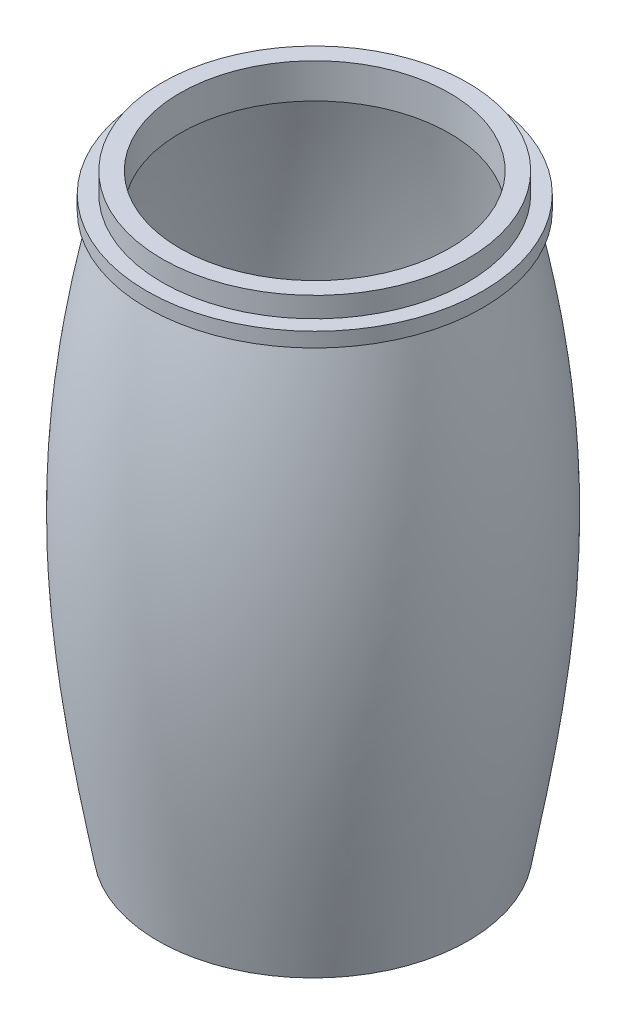
ISO-10303-21;
HEADER;
FILE_DESCRIPTION(('STEP AP214'),'2;1');
FILE_NAME('part.step','',(''),(''),'','','');
FILE_SCHEMA(('AUTOMOTIVE_DESIGN { 1 0 10303 214 1 1 1 1 }'));
ENDSEC;
DATA;
#1=APPLICATION_CONTEXT('core data for automotive mechanical design processes');
#2=APPLICATION_PROTOCOL_DEFINITION('international standard','automotive_design',2000,#1);
#3=PRODUCT_CONTEXT('',#1,'mechanical');
#4=PRODUCT('Part','Part','',(#3));
#5=PRODUCT_RELATED_PRODUCT_CATEGORY('part','',(#4));
#6=PRODUCT_DEFINITION_FORMATION('','',#4);
#7=PRODUCT_DEFINITION_CONTEXT('part definition',#1,'design');
#8=PRODUCT_DEFINITION('design','',#6,#7);
#9=PRODUCT_DEFINITION_SHAPE('','',#8);
#10=(LENGTH_UNIT() NAMED_UNIT(*) SI_UNIT(.MILLI.,.METRE.));
#11=(NAMED_UNIT(*) PLANE_ANGLE_UNIT() SI_UNIT($,.RADIAN.));
#12=(NAMED_UNIT(*) SI_UNIT($,.STERADIAN.) SOLID_ANGLE_UNIT());
#13=UNCERTAINTY_MEASURE_WITH_UNIT(LENGTH_MEASURE(1.E-05),#10,'distance_accuracy_value','');
#14=(GEOMETRIC_REPRESENTATION_CONTEXT(3) GLOBAL_UNCERTAINTY_ASSIGNED_CONTEXT((#13)) GLOBAL_UNIT_ASSIGNED_CONTEXT((#10,
#11,#12)) REPRESENTATION_CONTEXT('',''));
#15=CARTESIAN_POINT('',(0.,0.,0.));
#16=DIRECTION('',(0.,0.,1.));
#17=DIRECTION('',(1.,0.,0.));
#18=AXIS2_PLACEMENT_3D('',#15,#16,#17);
#19=CARTESIAN_POINT('',(275.,0.,0.));
#20=CARTESIAN_POINT('',(334.204802314761,324.779890339904,0.));
#21=CARTESIAN_POINT('',(372.234274409589,596.01883272794,0.));
#22=CARTESIAN_POINT('',(272.550609758041,1000.,0.));
#23=CARTESIAN_POINT('',(271.553773111525,1004.03981167272,0.));
#24=CARTESIAN_POINT('',(270.55693646501,1008.07962334544,0.));
#25=CARTESIAN_POINT('',(269.560099818494,1012.11943501816,0.));
#26=B_SPLINE_CURVE_WITH_KNOTS('',3,(#19,#20,#21,#22,#23,#24,#25),.UNSPECIFIED.,.F.,.F.,(4,3,4),
(0.,1.,1.01),.UNSPECIFIED.);
#27=CARTESIAN_POINT('',(0.,0.,0.));
#28=DIRECTION('',(0.,-1.,0.));
#29=AXIS1_PLACEMENT('',#27,#28);
#30=SURFACE_OF_REVOLUTION('',#26,#29);
#31=CARTESIAN_POINT('',(0.,0.,0.));
#32=DIRECTION('',(0.,-1.,0.));
#33=DIRECTION('',(0.,0.,-1.));
#34=AXIS2_PLACEMENT_3D('',#31,#32,#33);
#35=CIRCLE('',#34,275.);
#36=CARTESIAN_POINT('',(0.,0.,-275.));
#37=VERTEX_POINT('',#36);
#38=EDGE_CURVE('E387',#37,#37,#35,.T.);
#39=ORIENTED_EDGE('',*,*,#38,.F.);
#40=EDGE_LOOP('',(#39));
#41=FACE_BOUND('',#40,.T.);
#42=CARTESIAN_POINT('',(0.,984.270895849354,0.));
#43=DIRECTION('',(0.,-1.,0.));
#44=DIRECTION('',(0.,0.,-1.));
#45=AXIS2_PLACEMENT_3D('',#42,#43,#44);
#46=CIRCLE('',#45,276.378481701434);
#47=CARTESIAN_POINT('',(0.,984.270895849354,-276.378481701434));
#48=VERTEX_POINT('',#47);
#49=EDGE_CURVE('E145',#48,#48,#46,.T.);
#50=ORIENTED_EDGE('',*,*,#49,.T.);
#51=EDGE_LOOP('',(#50));
#52=FACE_BOUND('',#51,.T.);
#53=ADVANCED_FACE('F42',(#41,#52),#30,.F.);
#54=CARTESIAN_POINT('',(0.,0.,0.));
#55=DIRECTION('',(0.,-1.,0.));
#56=DIRECTION('',(0.,0.,-1.));
#57=AXIS2_PLACEMENT_3D('',#54,#55,#56);
#58=PLANE('',#57);
#59=ORIENTED_EDGE('',*,*,#38,.T.);
#60=EDGE_LOOP('',(#59));
#61=FACE_BOUND('',#60,.T.);
#62=ADVANCED_FACE('F44',(#61),#58,.T.);
#63=CARTESIAN_POINT('',(3.,984.270895849354,0.));
#64=DIRECTION('',(0.,1.,0.));
#65=DIRECTION('',(0.,0.,1.));
#66=AXIS2_PLACEMENT_3D('',#63,#64,#65);
#67=PLANE('',#66);
#68=CARTESIAN_POINT('',(3.,984.270895849354,0.));
#69=DIRECTION('',(0.,1.,0.));
#70=DIRECTION('',(0.,0.,1.));
#71=AXIS2_PLACEMENT_3D('',#68,#69,#70);
#72=CIRCLE('',#71,238.662190357556);
#73=CARTESIAN_POINT('',(3.,984.270895849354,238.662190357556));
#74=VERTEX_POINT('',#73);
#75=EDGE_CURVE('E119',#74,#74,#72,.T.);
#76=ORIENTED_EDGE('',*,*,#75,.T.);
#77=EDGE_LOOP('',(#76));
#78=FACE_BOUND('',#77,.T.);
#79=CARTESIAN_POINT('',(0.,984.270895849354,0.));
#80=DIRECTION('',(0.,-1.,0.));
#81=DIRECTION('',(0.,0.,-1.));
#82=AXIS2_PLACEMENT_3D('',#79,#80,#81);
#83=CIRCLE('',#82,271.236255874264);
#84=CARTESIAN_POINT('',(0.,984.270895849354,-271.236255874264));
#85=VERTEX_POINT('',#84);
#86=EDGE_CURVE('E46',#85,#85,#83,.T.);
#87=ORIENTED_EDGE('',*,*,#86,.T.);
#88=EDGE_LOOP('',(#87));
#89=FACE_BOUND('',#88,.T.);
#90=ADVANCED_FACE('F181',(#78,#89),#67,.F.);
#91=CARTESIAN_POINT('',(3.,1010.,0.));
#92=DIRECTION('',(0.,1.,0.));
#93=DIRECTION('',(0.,0.,1.));
#94=AXIS2_PLACEMENT_3D('',#91,#92,#93);
#95=PLANE('',#94);
#96=CARTESIAN_POINT('',(3.,1010.,0.));
#97=DIRECTION('',(0.,1.,0.));
#98=DIRECTION('',(0.,0.,1.));
#99=AXIS2_PLACEMENT_3D('',#96,#97,#98);
#100=CIRCLE('',#99,297.647770332171);
#101=CARTESIAN_POINT('',(3.,1010.,297.647770332171));
#102=VERTEX_POINT('',#101);
#103=EDGE_CURVE('E127',#102,#102,#100,.T.);
#104=ORIENTED_EDGE('',*,*,#103,.T.);
#105=EDGE_LOOP('',(#104));
#106=FACE_BOUND('',#105,.T.);
#107=CARTESIAN_POINT('',(3.,1010.,0.));
#108=DIRECTION('',(0.,1.,0.));
#109=DIRECTION('',(0.,0.,1.));
#110=AXIS2_PLACEMENT_3D('',#107,#108,#109);
#111=CIRCLE('',#110,270.625833245653);
#112=CARTESIAN_POINT('',(3.,1010.,270.625833245653));
#113=VERTEX_POINT('',#112);
#114=EDGE_CURVE('E107',#113,#113,#111,.T.);
#115=ORIENTED_EDGE('',*,*,#114,.F.);
#116=EDGE_LOOP('',(#115));
#117=FACE_BOUND('',#116,.T.);
#118=ADVANCED_FACE('F177',(#106,#117),#95,.T.);
#119=CARTESIAN_POINT('',(3.,994.270895849354,0.));
#120=DIRECTION('',(0.,1.,0.));
#121=DIRECTION('',(0.,0.,1.));
#122=AXIS2_PLACEMENT_3D('',#119,#120,#121);
#123=CYLINDRICAL_SURFACE('',#122,297.647770332171);
#124=CARTESIAN_POINT('',(3.,984.270895849354,0.));
#125=DIRECTION('',(0.,1.,0.));
#126=DIRECTION('',(0.,0.,1.));
#127=AXIS2_PLACEMENT_3D('',#124,#125,#126);
#128=CIRCLE('',#127,297.647770332171);
#129=CARTESIAN_POINT('',(3.,984.270895849354,297.647770332171));
#130=VERTEX_POINT('',#129);
#131=EDGE_CURVE('E123',#130,#130,#128,.T.);
#132=ORIENTED_EDGE('',*,*,#131,.T.);
#133=EDGE_LOOP('',(#132));
#134=FACE_BOUND('',#133,.T.);
#135=ORIENTED_EDGE('',*,*,#103,.F.);
#136=EDGE_LOOP('',(#135));
#137=FACE_BOUND('',#136,.T.);
#138=ADVANCED_FACE('F180',(#134,#137),#123,.T.);
#139=ORIENTED_EDGE('',*,*,#49,.F.);
#140=EDGE_LOOP('',(#139));
#141=FACE_BOUND('',#140,.T.);
#142=ORIENTED_EDGE('',*,*,#131,.F.);
#143=EDGE_LOOP('',(#142));
#144=FACE_BOUND('',#143,.T.);
#145=ADVANCED_FACE('F185',(#141,#144),#67,.F.);
#146=CARTESIAN_POINT('',(3.,994.270895849354,0.));
#147=DIRECTION('',(0.,1.,0.));
#148=DIRECTION('',(0.,0.,1.));
#149=AXIS2_PLACEMENT_3D('',#146,#147,#148);
#150=CYLINDRICAL_SURFACE('',#149,238.662190357556);
#151=CARTESIAN_POINT('',(3.,1046.00067138125,0.));
#152=DIRECTION('',(0.,1.,0.));
#153=DIRECTION('',(0.,0.,1.));
#154=AXIS2_PLACEMENT_3D('',#151,#152,#153);
#155=CIRCLE('',#154,238.662190357556);
#156=CARTESIAN_POINT('',(3.,1046.00067138125,238.662190357556));
#157=VERTEX_POINT('',#156);
#158=EDGE_CURVE('E115',#157,#157,#155,.T.);
#159=ORIENTED_EDGE('',*,*,#158,.T.);
#160=EDGE_LOOP('',(#159));
#161=FACE_BOUND('',#160,.T.);
#162=ORIENTED_EDGE('',*,*,#75,.F.);
#163=EDGE_LOOP('',(#162));
#164=FACE_BOUND('',#163,.T.);
#165=ADVANCED_FACE('F189',(#161,#164),#150,.F.);
#166=CARTESIAN_POINT('',(3.,1046.00067138125,0.));
#167=DIRECTION('',(0.,1.,0.));
#168=DIRECTION('',(0.,0.,1.));
#169=AXIS2_PLACEMENT_3D('',#166,#167,#168);
#170=PLANE('',#169);
#171=CARTESIAN_POINT('',(3.,1046.00067138125,0.));
#172=DIRECTION('',(0.,1.,0.));
#173=DIRECTION('',(0.,0.,1.));
#174=AXIS2_PLACEMENT_3D('',#171,#172,#173);
#175=CIRCLE('',#174,270.625833245653);
#176=CARTESIAN_POINT('',(3.,1046.00067138125,270.625833245653));
#177=VERTEX_POINT('',#176);
#178=EDGE_CURVE('E111',#177,#177,#175,.T.);
#179=ORIENTED_EDGE('',*,*,#178,.T.);
#180=EDGE_LOOP('',(#179));
#181=FACE_BOUND('',#180,.T.);
#182=ORIENTED_EDGE('',*,*,#158,.F.);
#183=EDGE_LOOP('',(#182));
#184=FACE_BOUND('',#183,.T.);
#185=ADVANCED_FACE('F193',(#181,#184),#170,.T.);
#186=CARTESIAN_POINT('',(3.,994.270895849354,0.));
#187=DIRECTION('',(0.,1.,0.));
#188=DIRECTION('',(0.,0.,1.));
#189=AXIS2_PLACEMENT_3D('',#186,#187,#188);
#190=CYLINDRICAL_SURFACE('',#189,270.625833245653);
#191=ORIENTED_EDGE('',*,*,#178,.F.);
#192=EDGE_LOOP('',(#191));
#193=FACE_BOUND('',#192,.T.);
#194=ORIENTED_EDGE('',*,*,#114,.T.);
#195=EDGE_LOOP('',(#194));
#196=FACE_BOUND('',#195,.T.);
#197=ADVANCED_FACE('F175',(#193,#196),#190,.T.);
#198=CARTESIAN_POINT('',(0.,5.,0.));
#199=DIRECTION('',(0.,-1.,0.));
#200=DIRECTION('',(0.,0.,-1.));
#201=AXIS2_PLACEMENT_3D('',#198,#199,#200);
#202=PLANE('',#201);
#203=CARTESIAN_POINT('',(0.,5.,0.));
#204=DIRECTION('',(0.,-1.,0.));
#205=DIRECTION('',(0.,0.,-1.));
#206=AXIS2_PLACEMENT_3D('',#203,#204,#205);
#207=CIRCLE('',#206,270.828443629604);
#208=CARTESIAN_POINT('',(0.,5.,-270.828443629604));
#209=VERTEX_POINT('',#208);
#210=EDGE_CURVE('E389',#209,#209,#207,.T.);
#211=ORIENTED_EDGE('',*,*,#210,.F.);
#212=EDGE_LOOP('',(#211));
#213=FACE_BOUND('',#212,.T.);
#214=ADVANCED_FACE('F172',(#213),#202,.F.);
#215=CARTESIAN_POINT('',(275.,0.,0.));
#216=CARTESIAN_POINT('',(334.204802314761,324.779890339904,0.));
#217=CARTESIAN_POINT('',(372.234274409589,596.01883272794,0.));
#218=CARTESIAN_POINT('',(271.553773111525,1004.03981167272,0.));
#219=CARTESIAN_POINT('',(270.55693646501,1008.07962334544,0.));
#220=CARTESIAN_POINT('',(269.560099818494,1012.11943501816,0.));
#221=B_SPLINE_CURVE_WITH_KNOTS('',3,(#215,#216,#217,#218,#219,#220),.UNSPECIFIED.,.F.,.F.,(4,2,
4),(0.,1.,1.01),.UNSPECIFIED.);
#222=CARTESIAN_POINT('',(0.,0.,0.));
#223=DIRECTION('',(0.,-1.,0.));
#224=AXIS1_PLACEMENT('',#222,#223);
#225=SURFACE_OF_REVOLUTION('',#221,#224);
#226=OFFSET_SURFACE('',#225,5.,.F.);
#227=ORIENTED_EDGE('',*,*,#210,.T.);
#228=EDGE_LOOP('',(#227));
#229=FACE_BOUND('',#228,.T.);
#230=ORIENTED_EDGE('',*,*,#86,.F.);
#231=EDGE_LOOP('',(#230));
#232=FACE_BOUND('',#231,.T.);
#233=ADVANCED_FACE('F170',(#229,#232),#226,.T.);
#234=CLOSED_SHELL('',(#53,#62,#90,#118,#138,#145,#165,#185,#197,#214,#233));
#235=CARTESIAN_POINT('',(3.,994.270895849354,0.));
#236=DIRECTION('',(0.,1.,0.));
#237=DIRECTION('',(0.,0.,1.));
#238=AXIS2_PLACEMENT_3D('',#235,#236,#237);
#239=CYLINDRICAL_SURFACE('',#238,270.625833245653);
#240=CARTESIAN_POINT('',(3.,994.270895849354,0.));
#241=DIRECTION('',(0.,1.,0.));
#242=DIRECTION('',(0.,0.,1.));
#243=AXIS2_PLACEMENT_3D('',#240,#241,#242);
#244=CIRCLE('',#243,270.625833245653);
#245=CARTESIAN_POINT('',(-161.763347415489,994.270895849354,214.68903318136));
#246=VERTEX_POINT('',#245);
#247=CARTESIAN_POINT('',(-161.763347415497,994.270895849354,-214.689033181354));
#248=VERTEX_POINT('',#247);
#249=EDGE_CURVE('E79',#246,#248,#244,.F.);
#250=ORIENTED_EDGE('',*,*,#249,.F.);
#251=CARTESIAN_POINT('',(-161.763347415489,994.270895849354,214.68903318136));
#252=CARTESIAN_POINT('',(-164.177344048722,994.380947843191,212.836435059327));
#253=CARTESIAN_POINT('',(-166.560109817544,994.489560540003,210.9430585513));
#254=CARTESIAN_POINT('',(-171.260447371596,994.703785357315,207.077025815732));
#255=CARTESIAN_POINT('',(-173.578021191126,994.809397571446,205.104372066696));
#256=CARTESIAN_POINT('',(-178.145343286024,995.017504032631,201.081990317334));
#257=CARTESIAN_POINT('',(-180.395093058982,995.119998348531,199.032264021058));
#258=CARTESIAN_POINT('',(-184.824231060039,995.321756026177,194.858050508596));
#259=CARTESIAN_POINT('',(-187.003620140726,995.421019427076,192.733564198959));
#260=CARTESIAN_POINT('',(-191.289571518984,995.616205529584,188.412220670387));
#261=CARTESIAN_POINT('',(-193.396133998455,995.712128239538,186.215363632242));
#262=CARTESIAN_POINT('',(-197.532698118283,995.900465458044,181.753206653212));
#263=CARTESIAN_POINT('',(-199.56274826136,995.992882189358,179.487951769401));
#264=CARTESIAN_POINT('',(-203.545387614709,996.174169000955,174.890235538527));
#265=CARTESIAN_POINT('',(-205.49797745571,996.263039110117,172.557774738962));
#266=CARTESIAN_POINT('',(-209.323470910115,996.437133848815,167.828292947291));
#267=CARTESIAN_POINT('',(-211.196375055208,996.522358502675,165.431272386124));
#268=CARTESIAN_POINT('',(-214.860370633936,996.689067973479,160.57537629474));
#269=CARTESIAN_POINT('',(-216.651462415656,996.770552806336,158.116501027764));
#270=CARTESIAN_POINT('',(-220.149770740567,996.929691150564,153.139718821658));
#271=CARTESIAN_POINT('',(-221.856987465572,997.007344670241,150.621812010506));
#272=CARTESIAN_POINT('',(-225.602714049679,997.177705046136,144.891717327073));
#273=CARTESIAN_POINT('',(-227.617048091758,997.2693083254,141.663650809302));
#274=CARTESIAN_POINT('',(-231.507903715852,997.446228963362,135.125340455895));
#275=CARTESIAN_POINT('',(-233.384423503297,997.531546240205,131.815095550911));
#276=CARTESIAN_POINT('',(-236.996313338716,997.695747226427,125.118281116028));
#277=CARTESIAN_POINT('',(-238.731682659915,997.774630902679,121.731711193252));
#278=CARTESIAN_POINT('',(-242.058141814432,997.92582626818,114.888307545338));
#279=CARTESIAN_POINT('',(-243.649231948767,997.99813797114,111.431473966815));
#280=CARTESIAN_POINT('',(-246.683967078053,998.136049105777,104.454426508696));
#281=CARTESIAN_POINT('',(-248.12764354593,998.20164997023,100.934226347495));
#282=CARTESIAN_POINT('',(-250.865351123112,998.326042757421,93.8360019082885));
#283=CARTESIAN_POINT('',(-252.159382421888,998.384834688781,90.2579777035031));
#284=CARTESIAN_POINT('',(-254.595486867653,998.495507529443,83.0504482298175));
#285=CARTESIAN_POINT('',(-255.737560421711,998.547388457259,79.4209430988545));
#286=CARTESIAN_POINT('',(-257.867684465817,998.644148165916,72.1170256250889));
#287=CARTESIAN_POINT('',(-258.85573552577,998.689026972667,68.4426134485035));
#288=CARTESIAN_POINT('',(-260.978691249529,998.785450414105,59.8270992771451));
#289=CARTESIAN_POINT('',(-262.053228809716,998.834251589102,54.8709615264474));
#290=CARTESIAN_POINT('',(-263.922229387149,998.919140087366,44.9061819277174));
#291=CARTESIAN_POINT('',(-264.716691285037,998.95522735982,39.8975398699273));
#292=CARTESIAN_POINT('',(-266.023061913725,999.014568821433,29.8434367202617));
#293=CARTESIAN_POINT('',(-266.534971125484,999.037823032436,24.7979756910741));
#294=CARTESIAN_POINT('',(-267.274639405664,999.071424094676,14.6855760520174));
#295=CARTESIAN_POINT('',(-267.502362107548,999.081769293983,9.61863477661091));
#296=CARTESIAN_POINT('',(-267.672823664985,999.089513160017,-0.520020393911148));
#297=CARTESIAN_POINT('',(-267.615562028873,999.086911804408,-5.59173429724555));
#298=CARTESIAN_POINT('',(-267.216208714005,999.068769830983,-15.7240400204323));
#299=CARTESIAN_POINT('',(-266.874118344172,999.05322927263,-20.7846318912885));
#300=CARTESIAN_POINT('',(-266.027494707648,999.014770325672,-29.6140594935041));
#301=CARTESIAN_POINT('',(-265.585102457701,998.994674476862,-33.3889907416779));
#302=CARTESIAN_POINT('',(-264.541717902205,998.947279769333,-40.9171258998054));
#303=CARTESIAN_POINT('',(-263.940715473696,998.919980450867,-44.6703284073379));
#304=CARTESIAN_POINT('',(-262.58117402013,998.858230212064,-52.148077330237));
#305=CARTESIAN_POINT('',(-261.822637334417,998.823779397926,-55.8726241702815));
#306=CARTESIAN_POINT('',(-260.567799177429,998.766787328422,-61.4326247764299));
#307=CARTESIAN_POINT('',(-260.130014277799,998.746903997543,-63.2814883419919));
#308=CARTESIAN_POINT('',(-259.215583215997,998.705371026372,-66.9696908216248));
#309=CARTESIAN_POINT('',(-258.73893451628,998.683721270745,-68.8090291054064));
#310=CARTESIAN_POINT('',(-257.250925690704,998.616132863904,-74.3117672045187));
#311=CARTESIAN_POINT('',(-256.181565146293,998.567557902521,-77.9596142082152));
#312=CARTESIAN_POINT('',(-253.890176348897,998.463465994014,-85.2069390732063));
#313=CARTESIAN_POINT('',(-252.668148098707,998.407949047015,-88.8064169353864));
#314=CARTESIAN_POINT('',(-250.722300471123,998.319542066352,-94.1644706920419));
#315=CARTESIAN_POINT('',(-250.054843618977,998.289215990603,-95.9437255311718));
#316=CARTESIAN_POINT('',(-248.682660554077,998.226868027983,-99.4876393025727));
#317=CARTESIAN_POINT('',(-247.977936768501,998.194846251552,-101.252299176772));
#318=CARTESIAN_POINT('',(-245.808361306348,998.096259325366,-106.523132214394));
#319=CARTESIAN_POINT('',(-244.287953060889,998.027165651929,-110.006578588293));
#320=CARTESIAN_POINT('',(-241.100872353011,997.882317868437,-116.908358658232));
#321=CARTESIAN_POINT('',(-239.434106020352,997.806559483751,-120.326648829078));
#322=CARTESIAN_POINT('',(-235.958055750461,997.648548828082,-127.089908954007));
#323=CARTESIAN_POINT('',(-234.148770384284,997.566296491987,-130.43487817252));
#324=CARTESIAN_POINT('',(-230.390849439648,997.39543795698,-137.045649447015));
#325=CARTESIAN_POINT('',(-228.442206797317,997.306831435979,-140.311447478644));
#326=CARTESIAN_POINT('',(-224.408943983857,997.123413693274,-146.758209410608));
#327=CARTESIAN_POINT('',(-222.324311405442,997.028601905418,-149.939165532833));
#328=CARTESIAN_POINT('',(-218.025060440209,996.833041755513,-156.207212440656));
#329=CARTESIAN_POINT('',(-215.810571343914,996.732299297905,-159.294392095464));
#330=CARTESIAN_POINT('',(-211.253753822189,996.524970965126,-165.372601527337));
#331=CARTESIAN_POINT('',(-208.911428616749,996.418385237138,-168.363633723192));
#332=CARTESIAN_POINT('',(-204.10356163925,996.199576035887,-174.243728166105));
#333=CARTESIAN_POINT('',(-201.638044396461,996.087353684931,-177.132810518881));
#334=CARTESIAN_POINT('',(-196.588597761117,995.857485141127,-182.803556430256));
#335=CARTESIAN_POINT('',(-194.004713041361,995.739840994408,-185.585259795947));
#336=CARTESIAN_POINT('',(-189.82776704461,995.549635287514,-189.896463948929));
#337=CARTESIAN_POINT('',(-188.272530659284,995.478808260867,-191.462875468203));
#338=CARTESIAN_POINT('',(-185.124548962595,995.335432836733,-194.556842233365));
#339=CARTESIAN_POINT('',(-183.531811634715,995.262884805601,-196.084405608047));
#340=CARTESIAN_POINT('',(-180.30966783294,995.116104662213,-199.099914102158));
#341=CARTESIAN_POINT('',(-178.680265234074,995.041872727916,-200.587863372318));
#342=CARTESIAN_POINT('',(-175.388644840987,994.891899403625,-203.520719181401));
#343=CARTESIAN_POINT('',(-173.726493293084,994.816161058418,-204.965700219737));
#344=CARTESIAN_POINT('',(-170.367281409703,994.663078615434,-207.814768545417));
#345=CARTESIAN_POINT('',(-168.67021747795,994.585734352225,-209.218851583563));
#346=CARTESIAN_POINT('',(-165.242009544309,994.42947687973,-211.98542712326));
#347=CARTESIAN_POINT('',(-163.510858545239,994.35056334828,-213.347910936042));
#348=CARTESIAN_POINT('',(-161.763347415497,994.270895849354,-214.689033181354));
#349=B_SPLINE_CURVE_WITH_KNOTS('',3,(#251,#252,#253,#254,#255,#256,#257,#258,#259,#260,#261,
#262,#263,#264,#265,#266,#267,#268,#269,#270,#271,#272,#273,#274,#275,#276,#277,#278,#279,#280,
#281,#282,#283,#284,#285,#286,#287,#288,#289,#290,#291,#292,#293,#294,#295,#296,#297,#298,#299,
#300,#301,#302,#303,#304,#305,#306,#307,#308,#309,#310,#311,#312,#313,#314,#315,#316,#317,#318,
#319,#320,#321,#322,#323,#324,#325,#326,#327,#328,#329,#330,#331,#332,#333,#334,#335,#336,#337,
#338,#339,#340,#341,#342,#343,#344,#345,#346,#347,#348),.UNSPECIFIED.,.F.,.F.,(4,2,2,2,2,2,2,2,
2,2,2,2,2,2,2,2,2,2,2,2,2,2,2,2,2,2,2,2,2,2,2,2,2,2,2,2,2,2,2,2,2,2,2,2,2,2,2,2,4),(0.,
9.13436169112395,18.2684380295109,27.40231253474,36.5360763195903,45.6698172891263,
54.7976673221231,63.9254430152938,73.0531577951855,82.1808337359336,91.3084898901418,
102.723259031935,114.138176786677,125.553153312513,136.968106022159,148.380616512735,
159.793112553437,171.205578021432,182.618001260544,197.824176167341,213.03041184687,
228.236621642337,243.444777133522,258.652958862322,273.861070702677,285.260333462377,
296.660323932022,308.060145126781,313.760055553355,319.460338444253,330.861752587794,
342.263166522586,347.964505208012,353.665473024131,365.066069699749,376.474032586633,
387.882109868174,399.290765823414,410.700464127573,422.098989237721,433.49722736942,
444.893204925935,456.284916426886,462.909807992746,469.533301731068,476.156098712215,
482.766650070333,489.377885815603,495.99049312251),.UNSPECIFIED.);
#350=EDGE_CURVE('E66',#246,#248,#349,.T.);
#351=ORIENTED_EDGE('',*,*,#350,.T.);
#352=EDGE_LOOP('',(#250,#351));
#353=FACE_BOUND('',#352,.T.);
#354=ADVANCED_FACE('F78',(#353),#239,.T.);
#355=CARTESIAN_POINT('',(3.,994.270895849354,0.));
#356=DIRECTION('',(0.,1.,0.));
#357=DIRECTION('',(0.,0.,1.));
#358=AXIS2_PLACEMENT_3D('',#355,#356,#357);
#359=PLANE('',#358);
#360=CARTESIAN_POINT('',(0.,994.270895849354,0.));
#361=DIRECTION('',(0.,-1.,0.));
#362=DIRECTION('',(0.,0.,-1.));
#363=AXIS2_PLACEMENT_3D('',#360,#361,#362);
#364=CIRCLE('',#363,268.809898507126);
#365=EDGE_CURVE('E71',#246,#248,#364,.T.);
#366=ORIENTED_EDGE('',*,*,#365,.F.);
#367=ORIENTED_EDGE('',*,*,#249,.T.);
#368=EDGE_LOOP('',(#366,#367));
#369=FACE_BOUND('',#368,.T.);
#370=ADVANCED_FACE('F83',(#369),#359,.T.);
#371=ORIENTED_EDGE('',*,*,#350,.F.);
#372=ORIENTED_EDGE('',*,*,#365,.T.);
#373=EDGE_LOOP('',(#371,#372));
#374=FACE_BOUND('',#373,.T.);
#375=ADVANCED_FACE('F72',(#374),#226,.T.);
#376=CLOSED_SHELL('',(#354,#370,#375));
#377=CARTESIAN_POINT('',(3.,1000.,0.));
#378=DIRECTION('',(0.,1.,0.));
#379=DIRECTION('',(0.,0.,1.));
#380=AXIS2_PLACEMENT_3D('',#377,#378,#379);
#381=PLANE('',#380);
#382=CARTESIAN_POINT('',(0.,1000.,0.));
#383=DIRECTION('',(0.,-1.,0.));
#384=DIRECTION('',(0.,0.,-1.));
#385=AXIS2_PLACEMENT_3D('',#382,#383,#384);
#386=CIRCLE('',#385,272.550609758041);
#387=CARTESIAN_POINT('',(175.748876595979,1000.,208.317467473881));
#388=VERTEX_POINT('',#387);
#389=CARTESIAN_POINT('',(175.748876595976,1000.,-208.317467473883));
#390=VERTEX_POINT('',#389);
#391=EDGE_CURVE('E81',#388,#390,#386,.T.);
#392=ORIENTED_EDGE('',*,*,#391,.F.);
#393=CARTESIAN_POINT('',(3.,1000.,0.));
#394=DIRECTION('',(0.,1.,0.));
#395=DIRECTION('',(0.,0.,1.));
#396=AXIS2_PLACEMENT_3D('',#393,#394,#395);
#397=CIRCLE('',#396,270.625833245653);
#398=EDGE_CURVE('E59',#390,#388,#397,.F.);
#399=ORIENTED_EDGE('',*,*,#398,.F.);
#400=EDGE_LOOP('',(#392,#399));
#401=FACE_BOUND('',#400,.T.);
#402=CARTESIAN_POINT('',(3.,1000.,0.));
#403=DIRECTION('',(0.,1.,0.));
#404=DIRECTION('',(0.,0.,1.));
#405=AXIS2_PLACEMENT_3D('',#402,#403,#404);
#406=CIRCLE('',#405,287.647770332171);
#407=CARTESIAN_POINT('',(3.,1000.,287.647770332171));
#408=VERTEX_POINT('',#407);
#409=EDGE_CURVE('E103',#408,#408,#406,.T.);
#410=ORIENTED_EDGE('',*,*,#409,.F.);
#411=EDGE_LOOP('',(#410));
#412=FACE_BOUND('',#411,.T.);
#413=ADVANCED_FACE('F201',(#401,#412),#381,.F.);
#414=CARTESIAN_POINT('',(0.,994.270895849354,0.));
#415=DIRECTION('',(0.,-1.,0.));
#416=DIRECTION('',(0.,0.,-1.));
#417=AXIS2_PLACEMENT_3D('',#414,#415,#416);
#418=CIRCLE('',#417,273.95723404639);
#419=CARTESIAN_POINT('',(0.,994.270895849354,-273.95723404639));
#420=VERTEX_POINT('',#419);
#421=EDGE_CURVE('E11',#420,#420,#418,.T.);
#422=ORIENTED_EDGE('',*,*,#421,.T.);
#423=EDGE_LOOP('',(#422));
#424=FACE_BOUND('',#423,.T.);
#425=CARTESIAN_POINT('',(3.,994.270895849354,0.));
#426=DIRECTION('',(0.,1.,0.));
#427=DIRECTION('',(0.,0.,1.));
#428=AXIS2_PLACEMENT_3D('',#425,#426,#427);
#429=CIRCLE('',#428,287.647770332171);
#430=CARTESIAN_POINT('',(3.,994.270895849354,287.647770332171));
#431=VERTEX_POINT('',#430);
#432=EDGE_CURVE('E99',#431,#431,#429,.T.);
#433=ORIENTED_EDGE('',*,*,#432,.T.);
#434=EDGE_LOOP('',(#433));
#435=FACE_BOUND('',#434,.T.);
#436=ADVANCED_FACE('F204',(#424,#435),#359,.T.);
#437=CARTESIAN_POINT('',(3.,994.270895849354,0.));
#438=DIRECTION('',(0.,1.,0.));
#439=DIRECTION('',(0.,0.,1.));
#440=AXIS2_PLACEMENT_3D('',#437,#438,#439);
#441=CYLINDRICAL_SURFACE('',#440,287.647770332171);
#442=ORIENTED_EDGE('',*,*,#432,.F.);
#443=EDGE_LOOP('',(#442));
#444=FACE_BOUND('',#443,.T.);
#445=ORIENTED_EDGE('',*,*,#409,.T.);
#446=EDGE_LOOP('',(#445));
#447=FACE_BOUND('',#446,.T.);
#448=ADVANCED_FACE('F155',(#444,#447),#441,.F.);
#449=CARTESIAN_POINT('',(175.748876595976,1000.,-208.317467473883));
#450=CARTESIAN_POINT('',(178.091165075134,999.895515575504,-206.375133780617));
#451=CARTESIAN_POINT('',(180.400705878908,999.79247830405,-204.393233236482));
#452=CARTESIAN_POINT('',(184.95164766688,999.589418312653,-200.352677775817));
#453=CARTESIAN_POINT('',(187.19305079131,999.489395498024,-198.294025274629));
#454=CARTESIAN_POINT('',(191.605171344524,999.292480268514,-194.102269371465));
#455=CARTESIAN_POINT('',(193.775890343108,999.195587784111,-191.969167625091));
#456=CARTESIAN_POINT('',(198.044196346085,999.005044686525,-187.630920871731));
#457=CARTESIAN_POINT('',(200.141784241385,998.911394033849,-185.425776743025));
#458=CARTESIAN_POINT('',(204.261455346006,998.727442816785,-180.945926812188));
#459=CARTESIAN_POINT('',(206.283538745162,998.637142243974,-178.671221184975));
#460=CARTESIAN_POINT('',(210.248597351665,998.460054400021,-174.056339001897));
#461=CARTESIAN_POINT('',(212.191623547956,998.373264864604,-171.716206341745));
#462=CARTESIAN_POINT('',(215.997738216504,998.203238450117,-166.971716815492));
#463=CARTESIAN_POINT('',(217.860827337291,998.120001542224,-164.567360470694));
#464=CARTESIAN_POINT('',(221.504944690906,997.957177486097,-159.697152102031));
#465=CARTESIAN_POINT('',(223.285973468841,997.877590313619,-157.231300486831));
#466=CARTESIAN_POINT('',(226.763947949396,997.722158305629,-152.240885287722));
#467=CARTESIAN_POINT('',(228.46089400866,997.646313454244,-149.716321952911));
#468=CARTESIAN_POINT('',(231.768749247387,997.498455582564,-144.611382599528));
#469=CARTESIAN_POINT('',(233.379658615163,997.426442553884,-142.031006703133));
#470=CARTESIAN_POINT('',(236.906316395388,997.268775455787,-136.164033217933));
#471=CARTESIAN_POINT('',(238.79730955013,997.184224591977,-132.862484255482));
#472=CARTESIAN_POINT('',(242.438494313569,997.021402118437,-126.182487140722));
#473=CARTESIAN_POINT('',(244.188684092148,996.943130590325,-122.804037989622));
#474=CARTESIAN_POINT('',(247.545149859193,996.793009766276,-115.976214616293));
#475=CARTESIAN_POINT('',(249.151425106263,996.721160503425,-112.526840028795));
#476=CARTESIAN_POINT('',(252.217164777336,996.584017364403,-105.56334002604));
#477=CARTESIAN_POINT('',(253.676629509362,996.518723474477,-102.049214746653));
#478=CARTESIAN_POINT('',(256.445866319935,996.394823327116,-94.9631596846779));
#479=CARTESIAN_POINT('',(257.755668211321,996.336215737773,-91.3912415768264));
#480=CARTESIAN_POINT('',(260.223567845804,996.225781236664,-84.1952850303732));
#481=CARTESIAN_POINT('',(261.381665780857,996.173954316318,-80.5712466577277));
#482=CARTESIAN_POINT('',(263.544087520766,996.077176520579,-73.2774746238053));
#483=CARTESIAN_POINT('',(264.548411733829,996.032225626932,-69.6077410838586));
#484=CARTESIAN_POINT('',(266.401472396639,995.949283457992,-62.2292250182736));
#485=CARTESIAN_POINT('',(267.250209422004,995.91129215695,-58.5204426371564));
#486=CARTESIAN_POINT('',(269.046735540706,995.830872562445,-49.8313652638438));
#487=CARTESIAN_POINT('',(269.933624953935,995.791169203403,-44.8383247639529));
#488=CARTESIAN_POINT('',(271.425556603768,995.724377589517,-34.810361361456));
#489=CARTESIAN_POINT('',(272.030597693782,995.697289385991,-29.7754382885519));
#490=CARTESIAN_POINT('',(272.956951261395,995.655814975051,-19.6794760366298));
#491=CARTESIAN_POINT('',(273.278264184504,995.641428747693,-14.6184368986318));
#492=CARTESIAN_POINT('',(273.636138269913,995.62540552423,-4.48590023043492));
#493=CARTESIAN_POINT('',(273.672678057999,995.623769485117,0.585598056220721));
#494=CARTESIAN_POINT('',(273.460846298386,995.633253943223,10.7225979651188));
#495=CARTESIAN_POINT('',(273.212474331292,995.644374459221,15.7880995785229));
#496=CARTESIAN_POINT('',(272.43157435593,995.679337114766,25.8972359258045));
#497=CARTESIAN_POINT('',(271.899047864057,995.703179186424,30.9408707762294));
#498=CARTESIAN_POINT('',(270.720397533709,995.755946752302,39.731238950912));
#499=CARTESIAN_POINT('',(270.136129231794,995.782103503888,43.4864109748128));
#500=CARTESIAN_POINT('',(268.809950967952,995.841471812234,50.9690921958106));
#501=CARTESIAN_POINT('',(268.068031034749,995.87468381523,54.6965996277149));
#502=CARTESIAN_POINT('',(266.427915729823,995.948099663624,62.1169301238669));
#503=CARTESIAN_POINT('',(265.5297223606,995.988303419429,65.8097536319182));
#504=CARTESIAN_POINT('',(263.578677331199,996.075628222971,73.1541576958618));
#505=CARTESIAN_POINT('',(262.525828870277,996.122749127616,76.8057391032222));
#506=CARTESIAN_POINT('',(260.266918899321,996.223841042131,84.0625994049267));
#507=CARTESIAN_POINT('',(259.060800378927,996.27781460091,87.6678605176989));
#508=CARTESIAN_POINT('',(256.497790695682,996.392499785491,94.8243550469378));
#509=CARTESIAN_POINT('',(255.140896396554,996.453211551455,98.3755873378067));
#510=CARTESIAN_POINT('',(252.278785185201,996.581260407603,105.417615203609));
#511=CARTESIAN_POINT('',(250.77357036264,996.648597404445,108.9084116292));
#512=CARTESIAN_POINT('',(247.617647007225,996.7897667782,115.823107158246));
#513=CARTESIAN_POINT('',(245.966947679097,996.863598744179,119.247010477272));
#514=CARTESIAN_POINT('',(241.946565313614,997.043402663057,127.155803543081));
#515=CARTESIAN_POINT('',(239.521100875255,997.151863402254,131.612423284988));
#516=CARTESIAN_POINT('',(234.423665918231,997.379773177026,140.382175393871));
#517=CARTESIAN_POINT('',(231.751684539793,997.499222696688,144.695301428141));
#518=CARTESIAN_POINT('',(226.169300043092,997.748738846803,153.165052049131));
#519=CARTESIAN_POINT('',(223.258861145137,997.878807070546,157.321653012754));
#520=CARTESIAN_POINT('',(217.214299407316,998.148891832839,165.457589373364));
#521=CARTESIAN_POINT('',(214.080565909743,998.288891053625,169.437214576018));
#522=CARTESIAN_POINT('',(207.595566009054,998.578552814954,177.213502764366));
#523=CARTESIAN_POINT('',(204.244334303261,998.728213814143,181.010194765693));
#524=CARTESIAN_POINT('',(197.336162142387,999.036660592882,188.407505577139));
#525=CARTESIAN_POINT('',(193.77934620495,999.195440848745,192.008240560217));
#526=CARTESIAN_POINT('',(188.964649546974,999.410329090238,196.616562533038));
#527=CARTESIAN_POINT('',(187.794370963909,999.462557279048,197.716875020982));
#528=CARTESIAN_POINT('',(185.434594573132,999.567864379889,199.896320623298));
#529=CARTESIAN_POINT('',(184.245099967195,999.620943150186,200.975457200976));
#530=CARTESIAN_POINT('',(181.848697038509,999.727870522895,203.110949204605));
#531=CARTESIAN_POINT('',(180.641813735449,999.781718018371,204.167332783567));
#532=CARTESIAN_POINT('',(178.209280705855,999.890242893256,206.258630858232));
#533=CARTESIAN_POINT('',(176.983627944801,999.944920406843,207.293541817314));
#534=CARTESIAN_POINT('',(175.748876595979,1000.,208.31746747388));
#535=B_SPLINE_CURVE_WITH_KNOTS('',3,(#449,#450,#451,#452,#453,#454,#455,#456,#457,#458,#459,
#460,#461,#462,#463,#464,#465,#466,#467,#468,#469,#470,#471,#472,#473,#474,#475,#476,#477,#478,
#479,#480,#481,#482,#483,#484,#485,#486,#487,#488,#489,#490,#491,#492,#493,#494,#495,#496,#497,
#498,#499,#500,#501,#502,#503,#504,#505,#506,#507,#508,#509,#510,#511,#512,#513,#514,#515,#516,
#517,#518,#519,#520,#521,#522,#523,#524,#525,#526,#527,#528,#529,#530,#531,#532,#533,#534),
.UNSPECIFIED.,.F.,.F.,(4,2,2,2,2,2,2,2,2,2,2,2,2,2,2,2,2,2,2,2,2,2,2,2,2,2,2,2,2,2,2,2,2,2,2,2,
2,2,2,2,2,2,4),(0.,9.13351506670298,18.2667429487509,27.3997678552895,36.5326814613869,
45.6655721038727,54.7924758531119,63.9193055418346,73.0460745944612,82.172804931727,
91.2995152919697,102.71305658772,114.126746209196,125.540494626556,136.954219096312,
148.365665973736,159.777098411698,171.188500556396,182.599860481995,197.805529704841,
213.011260785467,228.21696798996,243.42381647803,258.630687350905,273.837477072886,
285.235636387392,296.63451683644,308.033251230033,319.431749858081,330.834500752385,
342.237488879039,353.640316373754,365.042422934842,380.259169859089,395.476587444737,
410.696292545394,425.89008059541,441.081450721715,456.263714286833,461.085043309196,
465.905577121296,470.719756974824,475.534723546305),.UNSPECIFIED.);
#536=EDGE_CURVE('E137',#390,#388,#535,.T.);
#537=ORIENTED_EDGE('',*,*,#536,.F.);
#538=ORIENTED_EDGE('',*,*,#398,.T.);
#539=EDGE_LOOP('',(#537,#538));
#540=FACE_BOUND('',#539,.T.);
#541=ADVANCED_FACE('F150',(#540),#239,.T.);
#542=ORIENTED_EDGE('',*,*,#421,.F.);
#543=EDGE_LOOP('',(#542));
#544=FACE_BOUND('',#543,.T.);
#545=ORIENTED_EDGE('',*,*,#391,.T.);
#546=ORIENTED_EDGE('',*,*,#536,.T.);
#547=EDGE_LOOP('',(#545,#546));
#548=FACE_BOUND('',#547,.T.);
#549=ADVANCED_FACE('F154',(#544,#548),#30,.F.);
#550=CLOSED_SHELL('',(#413,#436,#448,#541,#549));
#551=CARTESIAN_POINT('',(3.,1010.,248.662190357556));
#552=DIRECTION('',(0.,1.,0.));
#553=DIRECTION('',(0.,0.,1.));
#554=AXIS2_PLACEMENT_3D('',#551,#552,#553);
#555=PLANE('',#554);
#556=CARTESIAN_POINT('',(3.,1010.,0.));
#557=DIRECTION('',(0.,1.,0.));
#558=DIRECTION('',(0.,0.,1.));
#559=AXIS2_PLACEMENT_3D('',#556,#557,#558);
#560=CIRCLE('',#559,248.662190357556);
#561=CARTESIAN_POINT('',(3.,1010.,248.662190357556));
#562=VERTEX_POINT('',#561);
#563=EDGE_CURVE('E86',#562,#562,#560,.F.);
#564=ORIENTED_EDGE('',*,*,#563,.T.);
#565=EDGE_LOOP('',(#564));
#566=FACE_BOUND('',#565,.T.);
#567=CARTESIAN_POINT('',(3.,1010.,0.));
#568=DIRECTION('',(0.,1.,0.));
#569=DIRECTION('',(0.,0.,1.));
#570=AXIS2_PLACEMENT_3D('',#567,#568,#569);
#571=CIRCLE('',#570,260.625833245653);
#572=CARTESIAN_POINT('',(3.,1010.,260.625833245653));
#573=VERTEX_POINT('',#572);
#574=EDGE_CURVE('E131',#573,#573,#571,.T.);
#575=ORIENTED_EDGE('',*,*,#574,.T.);
#576=EDGE_LOOP('',(#575));
#577=FACE_BOUND('',#576,.T.);
#578=ADVANCED_FACE('F158',(#566,#577),#555,.T.);
#579=CARTESIAN_POINT('',(3.,994.270895849354,0.));
#580=DIRECTION('',(0.,1.,0.));
#581=DIRECTION('',(0.,0.,1.));
#582=AXIS2_PLACEMENT_3D('',#579,#580,#581);
#583=CYLINDRICAL_SURFACE('',#582,248.662190357556);
#584=ORIENTED_EDGE('',*,*,#563,.F.);
#585=EDGE_LOOP('',(#584));
#586=FACE_BOUND('',#585,.T.);
#587=CARTESIAN_POINT('',(3.,1036.00067138125,0.));
#588=DIRECTION('',(0.,1.,0.));
#589=DIRECTION('',(0.,0.,1.));
#590=AXIS2_PLACEMENT_3D('',#587,#588,#589);
#591=CIRCLE('',#590,248.662190357556);
#592=CARTESIAN_POINT('',(3.,1036.00067138125,248.662190357556));
#593=VERTEX_POINT('',#592);
#594=EDGE_CURVE('E91',#593,#593,#591,.T.);
#595=ORIENTED_EDGE('',*,*,#594,.F.);
#596=EDGE_LOOP('',(#595));
#597=FACE_BOUND('',#596,.T.);
#598=ADVANCED_FACE('F212',(#586,#597),#583,.T.);
#599=CARTESIAN_POINT('',(3.,1036.00067138125,0.));
#600=DIRECTION('',(0.,1.,0.));
#601=DIRECTION('',(0.,0.,1.));
#602=AXIS2_PLACEMENT_3D('',#599,#600,#601);
#603=PLANE('',#602);
#604=CARTESIAN_POINT('',(3.,1036.00067138125,0.));
#605=DIRECTION('',(0.,1.,0.));
#606=DIRECTION('',(0.,0.,1.));
#607=AXIS2_PLACEMENT_3D('',#604,#605,#606);
#608=CIRCLE('',#607,260.625833245653);
#609=CARTESIAN_POINT('',(3.,1036.00067138125,260.625833245653));
#610=VERTEX_POINT('',#609);
#611=EDGE_CURVE('E85',#610,#610,#608,.T.);
#612=ORIENTED_EDGE('',*,*,#611,.F.);
#613=EDGE_LOOP('',(#612));
#614=FACE_BOUND('',#613,.T.);
#615=ORIENTED_EDGE('',*,*,#594,.T.);
#616=EDGE_LOOP('',(#615));
#617=FACE_BOUND('',#616,.T.);
#618=ADVANCED_FACE('F215',(#614,#617),#603,.F.);
#619=CARTESIAN_POINT('',(3.,994.270895849354,0.));
#620=DIRECTION('',(0.,1.,0.));
#621=DIRECTION('',(0.,0.,1.));
#622=AXIS2_PLACEMENT_3D('',#619,#620,#621);
#623=CYLINDRICAL_SURFACE('',#622,260.625833245653);
#624=ORIENTED_EDGE('',*,*,#574,.F.);
#625=EDGE_LOOP('',(#624));
#626=FACE_BOUND('',#625,.T.);
#627=ORIENTED_EDGE('',*,*,#611,.T.);
#628=EDGE_LOOP('',(#627));
#629=FACE_BOUND('',#628,.T.);
#630=ADVANCED_FACE('F220',(#626,#629),#623,.F.);
#631=CLOSED_SHELL('',(#578,#598,#618,#630));
#632=ORIENTED_CLOSED_SHELL('',*,#234,.T.);
#633=ORIENTED_CLOSED_SHELL('',*,#550,.T.);
#634=ORIENTED_CLOSED_SHELL('',*,#631,.T.);
#635=BREP_WITH_VOIDS('B2',#376,(#632,#633,#634));
#636=ADVANCED_BREP_SHAPE_REPRESENTATION('',(#18,#635),#14);
#637=SHAPE_DEFINITION_REPRESENTATION(#9,#636);
ENDSEC;
END-ISO-10303-21;
